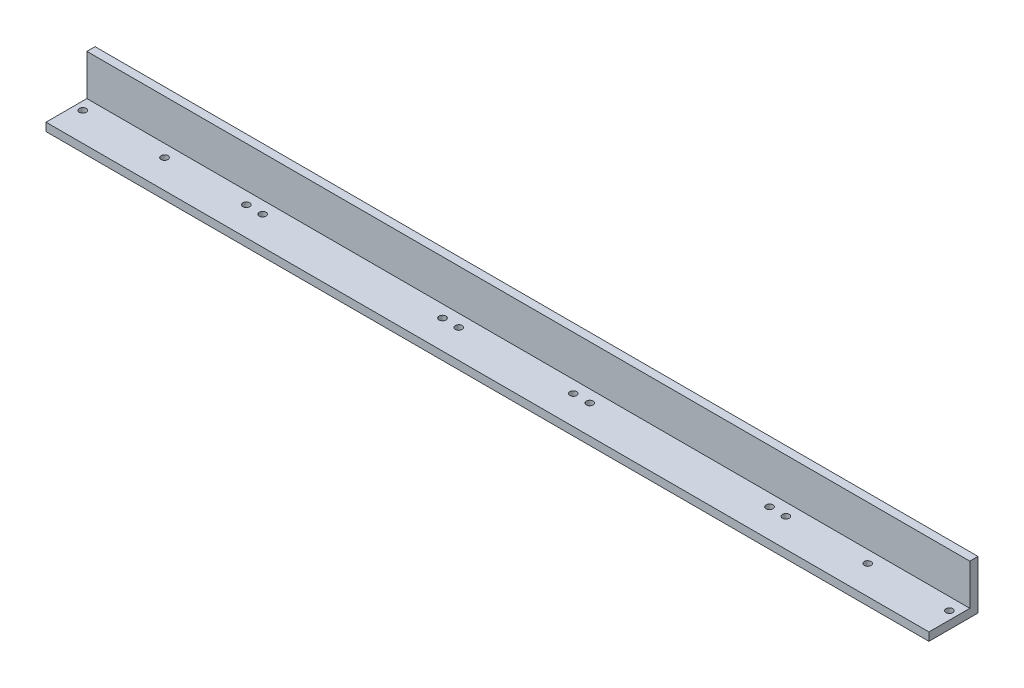
ISO-10303-21;
HEADER;
FILE_DESCRIPTION(('STEP AP214'),'2;1');
FILE_NAME('part.step','',(''),(''),'','','');
FILE_SCHEMA(('AUTOMOTIVE_DESIGN { 1 0 10303 214 1 1 1 1 }'));
ENDSEC;
DATA;
#1=APPLICATION_CONTEXT('core data for automotive mechanical design processes');
#2=APPLICATION_PROTOCOL_DEFINITION('international standard','automotive_design',2000,#1);
#3=PRODUCT_CONTEXT('',#1,'mechanical');
#4=PRODUCT('Part','Part','',(#3));
#5=PRODUCT_RELATED_PRODUCT_CATEGORY('part','',(#4));
#6=PRODUCT_DEFINITION_FORMATION('','',#4);
#7=PRODUCT_DEFINITION_CONTEXT('part definition',#1,'design');
#8=PRODUCT_DEFINITION('design','',#6,#7);
#9=PRODUCT_DEFINITION_SHAPE('','',#8);
#10=(LENGTH_UNIT() NAMED_UNIT(*) SI_UNIT(.MILLI.,.METRE.));
#11=(NAMED_UNIT(*) PLANE_ANGLE_UNIT() SI_UNIT($,.RADIAN.));
#12=(NAMED_UNIT(*) SI_UNIT($,.STERADIAN.) SOLID_ANGLE_UNIT());
#13=UNCERTAINTY_MEASURE_WITH_UNIT(LENGTH_MEASURE(1.E-05),#10,'distance_accuracy_value','');
#14=(GEOMETRIC_REPRESENTATION_CONTEXT(3) GLOBAL_UNCERTAINTY_ASSIGNED_CONTEXT((#13)) GLOBAL_UNIT_ASSIGNED_CONTEXT((#10,
#11,#12)) REPRESENTATION_CONTEXT('',''));
#15=CARTESIAN_POINT('',(0.,0.,0.));
#16=DIRECTION('',(0.,0.,1.));
#17=DIRECTION('',(1.,0.,0.));
#18=AXIS2_PLACEMENT_3D('',#15,#16,#17);
#19=CARTESIAN_POINT('',(342.9,0.,0.));
#20=DIRECTION('',(0.,0.,1.));
#21=DIRECTION('',(1.,0.,0.));
#22=AXIS2_PLACEMENT_3D('',#19,#20,#21);
#23=PLANE('',#22);
#24=DIRECTION('',(0.,1.,0.));
#25=VECTOR('',#24,1.);
#26=CARTESIAN_POINT('',(-342.9,0.,0.));
#27=LINE('',#26,#25);
#28=CARTESIAN_POINT('',(-342.9,0.,0.));
#29=VERTEX_POINT('',#28);
#30=CARTESIAN_POINT('',(-342.9,38.1,0.));
#31=VERTEX_POINT('',#30);
#32=EDGE_CURVE('E118',#29,#31,#27,.T.);
#33=ORIENTED_EDGE('',*,*,#32,.T.);
#34=DIRECTION('',(-1.,0.,0.));
#35=VECTOR('',#34,1.);
#36=CARTESIAN_POINT('',(342.9,38.1,0.));
#37=LINE('',#36,#35);
#38=CARTESIAN_POINT('',(342.9,38.1,0.));
#39=VERTEX_POINT('',#38);
#40=EDGE_CURVE('E11',#39,#31,#37,.T.);
#41=ORIENTED_EDGE('',*,*,#40,.F.);
#42=DIRECTION('',(0.,1.,0.));
#43=VECTOR('',#42,1.);
#44=CARTESIAN_POINT('',(342.9,0.,0.));
#45=LINE('',#44,#43);
#46=CARTESIAN_POINT('',(342.9,0.,0.));
#47=VERTEX_POINT('',#46);
#48=EDGE_CURVE('E83',#47,#39,#45,.T.);
#49=ORIENTED_EDGE('',*,*,#48,.F.);
#50=DIRECTION('',(-1.,0.,0.));
#51=VECTOR('',#50,1.);
#52=CARTESIAN_POINT('',(342.9,0.,0.));
#53=LINE('',#52,#51);
#54=EDGE_CURVE('E114',#47,#29,#53,.T.);
#55=ORIENTED_EDGE('',*,*,#54,.T.);
#56=EDGE_LOOP('',(#33,#41,#49,#55));
#57=FACE_BOUND('',#56,.T.);
#58=ADVANCED_FACE('F37',(#57),#23,.F.);
#59=CARTESIAN_POINT('',(342.9,38.1,6.35));
#60=DIRECTION('',(0.,1.,0.));
#61=DIRECTION('',(0.,0.,1.));
#62=AXIS2_PLACEMENT_3D('',#59,#60,#61);
#63=PLANE('',#62);
#64=DIRECTION('',(0.,0.,-1.));
#65=VECTOR('',#64,1.);
#66=CARTESIAN_POINT('',(-342.9,38.1,6.35));
#67=LINE('',#66,#65);
#68=CARTESIAN_POINT('',(-342.9,38.1,6.35));
#69=VERTEX_POINT('',#68);
#70=EDGE_CURVE('E121',#69,#31,#67,.T.);
#71=ORIENTED_EDGE('',*,*,#70,.F.);
#72=DIRECTION('',(-1.,0.,0.));
#73=VECTOR('',#72,1.);
#74=CARTESIAN_POINT('',(342.9,38.1,6.35));
#75=LINE('',#74,#73);
#76=CARTESIAN_POINT('',(342.9,38.1,6.35));
#77=VERTEX_POINT('',#76);
#78=EDGE_CURVE('E45',#77,#69,#75,.T.);
#79=ORIENTED_EDGE('',*,*,#78,.F.);
#80=DIRECTION('',(0.,0.,-1.));
#81=VECTOR('',#80,1.);
#82=CARTESIAN_POINT('',(342.9,38.1,6.35));
#83=LINE('',#82,#81);
#84=EDGE_CURVE('E230',#77,#39,#83,.T.);
#85=ORIENTED_EDGE('',*,*,#84,.T.);
#86=ORIENTED_EDGE('',*,*,#40,.T.);
#87=EDGE_LOOP('',(#71,#79,#85,#86));
#88=FACE_BOUND('',#87,.T.);
#89=ADVANCED_FACE('F140',(#88),#63,.T.);
#90=CARTESIAN_POINT('',(342.9,0.,6.35));
#91=DIRECTION('',(0.,0.,1.));
#92=DIRECTION('',(1.,0.,0.));
#93=AXIS2_PLACEMENT_3D('',#90,#91,#92);
#94=PLANE('',#93);
#95=DIRECTION('',(0.,1.,0.));
#96=VECTOR('',#95,1.);
#97=CARTESIAN_POINT('',(-342.9,0.,6.35));
#98=LINE('',#97,#96);
#99=CARTESIAN_POINT('',(-342.9,6.35,6.35));
#100=VERTEX_POINT('',#99);
#101=EDGE_CURVE('E125',#100,#69,#98,.T.);
#102=ORIENTED_EDGE('',*,*,#101,.F.);
#103=DIRECTION('',(-1.,0.,0.));
#104=VECTOR('',#103,1.);
#105=CARTESIAN_POINT('',(342.9,6.35,6.35));
#106=LINE('',#105,#104);
#107=CARTESIAN_POINT('',(342.9,6.35,6.35));
#108=VERTEX_POINT('',#107);
#109=EDGE_CURVE('E104',#108,#100,#106,.T.);
#110=ORIENTED_EDGE('',*,*,#109,.F.);
#111=DIRECTION('',(0.,1.,0.));
#112=VECTOR('',#111,1.);
#113=CARTESIAN_POINT('',(342.9,0.,6.35));
#114=LINE('',#113,#112);
#115=EDGE_CURVE('E110',#108,#77,#114,.T.);
#116=ORIENTED_EDGE('',*,*,#115,.T.);
#117=ORIENTED_EDGE('',*,*,#78,.T.);
#118=EDGE_LOOP('',(#102,#110,#116,#117));
#119=FACE_BOUND('',#118,.T.);
#120=ADVANCED_FACE('F137',(#119),#94,.T.);
#121=CARTESIAN_POINT('',(342.9,6.35,38.1));
#122=DIRECTION('',(0.,1.,0.));
#123=DIRECTION('',(0.,0.,1.));
#124=AXIS2_PLACEMENT_3D('',#121,#122,#123);
#125=PLANE('',#124);
#126=CARTESIAN_POINT('',(-336.55,6.35,15.875));
#127=DIRECTION('',(0.,1.,0.));
#128=DIRECTION('',(0.,0.,1.));
#129=AXIS2_PLACEMENT_3D('',#126,#127,#128);
#130=CIRCLE('',#129,2.66700000000003);
#131=CARTESIAN_POINT('',(-336.55,6.35,18.542));
#132=VERTEX_POINT('',#131);
#133=EDGE_CURVE('E176',#132,#132,#130,.T.);
#134=ORIENTED_EDGE('',*,*,#133,.F.);
#135=EDGE_LOOP('',(#134));
#136=FACE_BOUND('',#135,.T.);
#137=CARTESIAN_POINT('',(-273.05,6.35,15.8749999999995));
#138=DIRECTION('',(0.,1.,0.));
#139=DIRECTION('',(0.,0.,1.));
#140=AXIS2_PLACEMENT_3D('',#137,#138,#139);
#141=CIRCLE('',#140,2.66699999999997);
#142=CARTESIAN_POINT('',(-273.05,6.35,18.5419999999995));
#143=VERTEX_POINT('',#142);
#144=EDGE_CURVE('E180',#143,#143,#141,.T.);
#145=ORIENTED_EDGE('',*,*,#144,.F.);
#146=EDGE_LOOP('',(#145));
#147=FACE_BOUND('',#146,.T.);
#148=CARTESIAN_POINT('',(-209.55,6.35,15.875));
#149=DIRECTION('',(0.,1.,0.));
#150=DIRECTION('',(0.,0.,1.));
#151=AXIS2_PLACEMENT_3D('',#148,#149,#150);
#152=CIRCLE('',#151,2.66699999999997);
#153=CARTESIAN_POINT('',(-209.55,6.35,18.542));
#154=VERTEX_POINT('',#153);
#155=EDGE_CURVE('E184',#154,#154,#152,.T.);
#156=ORIENTED_EDGE('',*,*,#155,.F.);
#157=EDGE_LOOP('',(#156));
#158=FACE_BOUND('',#157,.T.);
#159=CARTESIAN_POINT('',(-196.85,6.35,15.875));
#160=DIRECTION('',(0.,1.,0.));
#161=DIRECTION('',(0.,0.,1.));
#162=AXIS2_PLACEMENT_3D('',#159,#160,#161);
#163=CIRCLE('',#162,2.667);
#164=CARTESIAN_POINT('',(-196.85,6.35,18.542));
#165=VERTEX_POINT('',#164);
#166=EDGE_CURVE('E188',#165,#165,#163,.T.);
#167=ORIENTED_EDGE('',*,*,#166,.F.);
#168=EDGE_LOOP('',(#167));
#169=FACE_BOUND('',#168,.T.);
#170=CARTESIAN_POINT('',(-57.1499999999999,6.35,15.875));
#171=DIRECTION('',(0.,1.,0.));
#172=DIRECTION('',(0.,0.,1.));
#173=AXIS2_PLACEMENT_3D('',#170,#171,#172);
#174=CIRCLE('',#173,2.66699999999999);
#175=CARTESIAN_POINT('',(-57.1499999999999,6.35,18.542));
#176=VERTEX_POINT('',#175);
#177=EDGE_CURVE('E192',#176,#176,#174,.T.);
#178=ORIENTED_EDGE('',*,*,#177,.F.);
#179=EDGE_LOOP('',(#178));
#180=FACE_BOUND('',#179,.T.);
#181=CARTESIAN_POINT('',(-44.4499999999999,6.35,15.875));
#182=DIRECTION('',(0.,1.,0.));
#183=DIRECTION('',(0.,0.,1.));
#184=AXIS2_PLACEMENT_3D('',#181,#182,#183);
#185=CIRCLE('',#184,2.66699999999999);
#186=CARTESIAN_POINT('',(-44.4499999999999,6.35,18.542));
#187=VERTEX_POINT('',#186);
#188=EDGE_CURVE('E196',#187,#187,#185,.T.);
#189=ORIENTED_EDGE('',*,*,#188,.F.);
#190=EDGE_LOOP('',(#189));
#191=FACE_BOUND('',#190,.T.);
#192=CARTESIAN_POINT('',(44.4500000000002,6.35,15.875));
#193=DIRECTION('',(0.,1.,0.));
#194=DIRECTION('',(0.,0.,1.));
#195=AXIS2_PLACEMENT_3D('',#192,#193,#194);
#196=CIRCLE('',#195,2.66699999999999);
#197=CARTESIAN_POINT('',(44.4500000000002,6.35,18.542));
#198=VERTEX_POINT('',#197);
#199=EDGE_CURVE('E200',#198,#198,#196,.T.);
#200=ORIENTED_EDGE('',*,*,#199,.F.);
#201=EDGE_LOOP('',(#200));
#202=FACE_BOUND('',#201,.T.);
#203=CARTESIAN_POINT('',(57.1500000000002,6.35,15.875));
#204=DIRECTION('',(0.,1.,0.));
#205=DIRECTION('',(0.,0.,1.));
#206=AXIS2_PLACEMENT_3D('',#203,#204,#205);
#207=CIRCLE('',#206,2.66699999999999);
#208=CARTESIAN_POINT('',(57.1500000000002,6.35,18.542));
#209=VERTEX_POINT('',#208);
#210=EDGE_CURVE('E204',#209,#209,#207,.T.);
#211=ORIENTED_EDGE('',*,*,#210,.F.);
#212=EDGE_LOOP('',(#211));
#213=FACE_BOUND('',#212,.T.);
#214=CARTESIAN_POINT('',(196.85,6.35,15.875));
#215=DIRECTION('',(0.,1.,0.));
#216=DIRECTION('',(0.,0.,1.));
#217=AXIS2_PLACEMENT_3D('',#214,#215,#216);
#218=CIRCLE('',#217,2.667);
#219=CARTESIAN_POINT('',(196.85,6.35,18.542));
#220=VERTEX_POINT('',#219);
#221=EDGE_CURVE('E208',#220,#220,#218,.T.);
#222=ORIENTED_EDGE('',*,*,#221,.F.);
#223=EDGE_LOOP('',(#222));
#224=FACE_BOUND('',#223,.T.);
#225=CARTESIAN_POINT('',(209.55,6.35,15.875));
#226=DIRECTION('',(0.,1.,0.));
#227=DIRECTION('',(0.,0.,1.));
#228=AXIS2_PLACEMENT_3D('',#225,#226,#227);
#229=CIRCLE('',#228,2.667);
#230=CARTESIAN_POINT('',(209.55,6.35,18.542));
#231=VERTEX_POINT('',#230);
#232=EDGE_CURVE('E212',#231,#231,#229,.T.);
#233=ORIENTED_EDGE('',*,*,#232,.F.);
#234=EDGE_LOOP('',(#233));
#235=FACE_BOUND('',#234,.T.);
#236=CARTESIAN_POINT('',(273.05,6.35,15.8749999999988));
#237=DIRECTION('',(0.,1.,0.));
#238=DIRECTION('',(0.,0.,1.));
#239=AXIS2_PLACEMENT_3D('',#236,#237,#238);
#240=CIRCLE('',#239,2.66700000000003);
#241=CARTESIAN_POINT('',(273.05,6.35,18.5419999999988));
#242=VERTEX_POINT('',#241);
#243=EDGE_CURVE('E216',#242,#242,#240,.T.);
#244=ORIENTED_EDGE('',*,*,#243,.F.);
#245=EDGE_LOOP('',(#244));
#246=FACE_BOUND('',#245,.T.);
#247=CARTESIAN_POINT('',(336.55,6.35,15.8749999999983));
#248=DIRECTION('',(0.,1.,0.));
#249=DIRECTION('',(0.,0.,1.));
#250=AXIS2_PLACEMENT_3D('',#247,#248,#249);
#251=CIRCLE('',#250,2.66700000000003);
#252=CARTESIAN_POINT('',(336.55,6.35,18.5419999999984));
#253=VERTEX_POINT('',#252);
#254=EDGE_CURVE('E219',#253,#253,#251,.T.);
#255=ORIENTED_EDGE('',*,*,#254,.F.);
#256=EDGE_LOOP('',(#255));
#257=FACE_BOUND('',#256,.T.);
#258=DIRECTION('',(0.,0.,-1.));
#259=VECTOR('',#258,1.);
#260=CARTESIAN_POINT('',(-342.9,6.35,38.1));
#261=LINE('',#260,#259);
#262=CARTESIAN_POINT('',(-342.9,6.35,38.1));
#263=VERTEX_POINT('',#262);
#264=EDGE_CURVE('E99',#263,#100,#261,.T.);
#265=ORIENTED_EDGE('',*,*,#264,.F.);
#266=DIRECTION('',(-1.,0.,0.));
#267=VECTOR('',#266,1.);
#268=CARTESIAN_POINT('',(342.9,6.35,38.1));
#269=LINE('',#268,#267);
#270=CARTESIAN_POINT('',(342.9,6.35,38.1));
#271=VERTEX_POINT('',#270);
#272=EDGE_CURVE('E94',#271,#263,#269,.T.);
#273=ORIENTED_EDGE('',*,*,#272,.F.);
#274=DIRECTION('',(0.,0.,-1.));
#275=VECTOR('',#274,1.);
#276=CARTESIAN_POINT('',(342.9,6.35,38.1));
#277=LINE('',#276,#275);
#278=EDGE_CURVE('E97',#271,#108,#277,.T.);
#279=ORIENTED_EDGE('',*,*,#278,.T.);
#280=ORIENTED_EDGE('',*,*,#109,.T.);
#281=EDGE_LOOP('',(#265,#273,#279,#280));
#282=FACE_BOUND('',#281,.T.);
#283=ADVANCED_FACE('F96',(#136,#147,#158,#169,#180,#191,#202,#213,#224,#235,#246,#257,#282),
#125,.T.);
#284=CARTESIAN_POINT('',(342.9,0.,38.1));
#285=DIRECTION('',(0.,0.,1.));
#286=DIRECTION('',(1.,0.,0.));
#287=AXIS2_PLACEMENT_3D('',#284,#285,#286);
#288=PLANE('',#287);
#289=DIRECTION('',(0.,1.,0.));
#290=VECTOR('',#289,1.);
#291=CARTESIAN_POINT('',(-342.9,0.,38.1));
#292=LINE('',#291,#290);
#293=CARTESIAN_POINT('',(-342.9,0.,38.1));
#294=VERTEX_POINT('',#293);
#295=EDGE_CURVE('E129',#294,#263,#292,.T.);
#296=ORIENTED_EDGE('',*,*,#295,.F.);
#297=DIRECTION('',(-1.,0.,0.));
#298=VECTOR('',#297,1.);
#299=CARTESIAN_POINT('',(342.9,0.,38.1));
#300=LINE('',#299,#298);
#301=CARTESIAN_POINT('',(342.9,0.,38.1));
#302=VERTEX_POINT('',#301);
#303=EDGE_CURVE('E74',#302,#294,#300,.T.);
#304=ORIENTED_EDGE('',*,*,#303,.F.);
#305=DIRECTION('',(0.,1.,0.));
#306=VECTOR('',#305,1.);
#307=CARTESIAN_POINT('',(342.9,0.,38.1));
#308=LINE('',#307,#306);
#309=EDGE_CURVE('E108',#302,#271,#308,.T.);
#310=ORIENTED_EDGE('',*,*,#309,.T.);
#311=ORIENTED_EDGE('',*,*,#272,.T.);
#312=EDGE_LOOP('',(#296,#304,#310,#311));
#313=FACE_BOUND('',#312,.T.);
#314=ADVANCED_FACE('F112',(#313),#288,.T.);
#315=CARTESIAN_POINT('',(342.9,0.,38.1));
#316=DIRECTION('',(0.,1.,0.));
#317=DIRECTION('',(0.,0.,1.));
#318=AXIS2_PLACEMENT_3D('',#315,#316,#317);
#319=PLANE('',#318);
#320=CARTESIAN_POINT('',(-336.55,0.,15.875));
#321=DIRECTION('',(0.,1.,0.));
#322=DIRECTION('',(0.,0.,1.));
#323=AXIS2_PLACEMENT_3D('',#320,#321,#322);
#324=CIRCLE('',#323,2.66700000000003);
#325=CARTESIAN_POINT('',(-336.55,0.,18.542));
#326=VERTEX_POINT('',#325);
#327=EDGE_CURVE('E122',#326,#326,#324,.F.);
#328=ORIENTED_EDGE('',*,*,#327,.F.);
#329=EDGE_LOOP('',(#328));
#330=FACE_BOUND('',#329,.T.);
#331=CARTESIAN_POINT('',(-273.05,0.,15.8749999999995));
#332=DIRECTION('',(0.,1.,0.));
#333=DIRECTION('',(0.,0.,1.));
#334=AXIS2_PLACEMENT_3D('',#331,#332,#333);
#335=CIRCLE('',#334,2.66699999999997);
#336=CARTESIAN_POINT('',(-273.05,0.,18.5419999999995));
#337=VERTEX_POINT('',#336);
#338=EDGE_CURVE('E265',#337,#337,#335,.F.);
#339=ORIENTED_EDGE('',*,*,#338,.F.);
#340=EDGE_LOOP('',(#339));
#341=FACE_BOUND('',#340,.T.);
#342=CARTESIAN_POINT('',(-209.55,0.,15.875));
#343=DIRECTION('',(0.,1.,0.));
#344=DIRECTION('',(0.,0.,1.));
#345=AXIS2_PLACEMENT_3D('',#342,#343,#344);
#346=CIRCLE('',#345,2.66699999999997);
#347=CARTESIAN_POINT('',(-209.55,0.,18.542));
#348=VERTEX_POINT('',#347);
#349=EDGE_CURVE('E261',#348,#348,#346,.F.);
#350=ORIENTED_EDGE('',*,*,#349,.F.);
#351=EDGE_LOOP('',(#350));
#352=FACE_BOUND('',#351,.T.);
#353=CARTESIAN_POINT('',(-196.85,0.,15.875));
#354=DIRECTION('',(0.,1.,0.));
#355=DIRECTION('',(0.,0.,1.));
#356=AXIS2_PLACEMENT_3D('',#353,#354,#355);
#357=CIRCLE('',#356,2.667);
#358=CARTESIAN_POINT('',(-196.85,0.,18.542));
#359=VERTEX_POINT('',#358);
#360=EDGE_CURVE('E257',#359,#359,#357,.F.);
#361=ORIENTED_EDGE('',*,*,#360,.F.);
#362=EDGE_LOOP('',(#361));
#363=FACE_BOUND('',#362,.T.);
#364=CARTESIAN_POINT('',(-57.1499999999999,0.,15.875));
#365=DIRECTION('',(0.,1.,0.));
#366=DIRECTION('',(0.,0.,1.));
#367=AXIS2_PLACEMENT_3D('',#364,#365,#366);
#368=CIRCLE('',#367,2.66699999999999);
#369=CARTESIAN_POINT('',(-57.1499999999999,0.,18.542));
#370=VERTEX_POINT('',#369);
#371=EDGE_CURVE('E253',#370,#370,#368,.F.);
#372=ORIENTED_EDGE('',*,*,#371,.F.);
#373=EDGE_LOOP('',(#372));
#374=FACE_BOUND('',#373,.T.);
#375=CARTESIAN_POINT('',(-44.4499999999999,0.,15.875));
#376=DIRECTION('',(0.,1.,0.));
#377=DIRECTION('',(0.,0.,1.));
#378=AXIS2_PLACEMENT_3D('',#375,#376,#377);
#379=CIRCLE('',#378,2.66699999999999);
#380=CARTESIAN_POINT('',(-44.4499999999999,0.,18.542));
#381=VERTEX_POINT('',#380);
#382=EDGE_CURVE('E249',#381,#381,#379,.F.);
#383=ORIENTED_EDGE('',*,*,#382,.F.);
#384=EDGE_LOOP('',(#383));
#385=FACE_BOUND('',#384,.T.);
#386=CARTESIAN_POINT('',(44.4500000000002,0.,15.875));
#387=DIRECTION('',(0.,1.,0.));
#388=DIRECTION('',(0.,0.,1.));
#389=AXIS2_PLACEMENT_3D('',#386,#387,#388);
#390=CIRCLE('',#389,2.66699999999999);
#391=CARTESIAN_POINT('',(44.4500000000002,0.,18.542));
#392=VERTEX_POINT('',#391);
#393=EDGE_CURVE('E245',#392,#392,#390,.F.);
#394=ORIENTED_EDGE('',*,*,#393,.F.);
#395=EDGE_LOOP('',(#394));
#396=FACE_BOUND('',#395,.T.);
#397=CARTESIAN_POINT('',(57.1500000000002,0.,15.875));
#398=DIRECTION('',(0.,1.,0.));
#399=DIRECTION('',(0.,0.,1.));
#400=AXIS2_PLACEMENT_3D('',#397,#398,#399);
#401=CIRCLE('',#400,2.66699999999999);
#402=CARTESIAN_POINT('',(57.1500000000002,0.,18.542));
#403=VERTEX_POINT('',#402);
#404=EDGE_CURVE('E241',#403,#403,#401,.F.);
#405=ORIENTED_EDGE('',*,*,#404,.F.);
#406=EDGE_LOOP('',(#405));
#407=FACE_BOUND('',#406,.T.);
#408=CARTESIAN_POINT('',(196.85,0.,15.875));
#409=DIRECTION('',(0.,1.,0.));
#410=DIRECTION('',(0.,0.,1.));
#411=AXIS2_PLACEMENT_3D('',#408,#409,#410);
#412=CIRCLE('',#411,2.667);
#413=CARTESIAN_POINT('',(196.85,0.,18.542));
#414=VERTEX_POINT('',#413);
#415=EDGE_CURVE('E237',#414,#414,#412,.F.);
#416=ORIENTED_EDGE('',*,*,#415,.F.);
#417=EDGE_LOOP('',(#416));
#418=FACE_BOUND('',#417,.T.);
#419=CARTESIAN_POINT('',(209.55,0.,15.875));
#420=DIRECTION('',(0.,1.,0.));
#421=DIRECTION('',(0.,0.,1.));
#422=AXIS2_PLACEMENT_3D('',#419,#420,#421);
#423=CIRCLE('',#422,2.667);
#424=CARTESIAN_POINT('',(209.55,0.,18.542));
#425=VERTEX_POINT('',#424);
#426=EDGE_CURVE('E233',#425,#425,#423,.F.);
#427=ORIENTED_EDGE('',*,*,#426,.F.);
#428=EDGE_LOOP('',(#427));
#429=FACE_BOUND('',#428,.T.);
#430=CARTESIAN_POINT('',(273.05,0.,15.8749999999988));
#431=DIRECTION('',(0.,1.,0.));
#432=DIRECTION('',(0.,0.,1.));
#433=AXIS2_PLACEMENT_3D('',#430,#431,#432);
#434=CIRCLE('',#433,2.66700000000003);
#435=CARTESIAN_POINT('',(273.05,0.,18.5419999999988));
#436=VERTEX_POINT('',#435);
#437=EDGE_CURVE('E226',#436,#436,#434,.F.);
#438=ORIENTED_EDGE('',*,*,#437,.F.);
#439=EDGE_LOOP('',(#438));
#440=FACE_BOUND('',#439,.T.);
#441=CARTESIAN_POINT('',(336.55,0.,15.8749999999983));
#442=DIRECTION('',(0.,1.,0.));
#443=DIRECTION('',(0.,0.,1.));
#444=AXIS2_PLACEMENT_3D('',#441,#442,#443);
#445=CIRCLE('',#444,2.66700000000003);
#446=CARTESIAN_POINT('',(336.55,0.,18.5419999999984));
#447=VERTEX_POINT('',#446);
#448=EDGE_CURVE('E221',#447,#447,#445,.F.);
#449=ORIENTED_EDGE('',*,*,#448,.F.);
#450=EDGE_LOOP('',(#449));
#451=FACE_BOUND('',#450,.T.);
#452=DIRECTION('',(0.,0.,-1.));
#453=VECTOR('',#452,1.);
#454=CARTESIAN_POINT('',(-342.9,0.,38.1));
#455=LINE('',#454,#453);
#456=EDGE_CURVE('E77',#294,#29,#455,.T.);
#457=ORIENTED_EDGE('',*,*,#456,.T.);
#458=ORIENTED_EDGE('',*,*,#54,.F.);
#459=DIRECTION('',(0.,0.,-1.));
#460=VECTOR('',#459,1.);
#461=CARTESIAN_POINT('',(342.9,0.,38.1));
#462=LINE('',#461,#460);
#463=EDGE_CURVE('E53',#302,#47,#462,.T.);
#464=ORIENTED_EDGE('',*,*,#463,.F.);
#465=ORIENTED_EDGE('',*,*,#303,.T.);
#466=EDGE_LOOP('',(#457,#458,#464,#465));
#467=FACE_BOUND('',#466,.T.);
#468=ADVANCED_FACE('F145',(#330,#341,#352,#363,#374,#385,#396,#407,#418,#429,#440,#451,#467),
#319,.F.);
#469=CARTESIAN_POINT('',(342.9,0.,0.));
#470=DIRECTION('',(-1.,0.,0.));
#471=DIRECTION('',(0.,0.,1.));
#472=AXIS2_PLACEMENT_3D('',#469,#470,#471);
#473=PLANE('',#472);
#474=ORIENTED_EDGE('',*,*,#48,.T.);
#475=ORIENTED_EDGE('',*,*,#84,.F.);
#476=ORIENTED_EDGE('',*,*,#115,.F.);
#477=ORIENTED_EDGE('',*,*,#278,.F.);
#478=ORIENTED_EDGE('',*,*,#309,.F.);
#479=ORIENTED_EDGE('',*,*,#463,.T.);
#480=EDGE_LOOP('',(#474,#475,#476,#477,#478,#479));
#481=FACE_BOUND('',#480,.T.);
#482=ADVANCED_FACE('F107',(#481),#473,.F.);
#483=CARTESIAN_POINT('',(-342.9,0.,0.));
#484=DIRECTION('',(-1.,0.,0.));
#485=DIRECTION('',(0.,0.,1.));
#486=AXIS2_PLACEMENT_3D('',#483,#484,#485);
#487=PLANE('',#486);
#488=ORIENTED_EDGE('',*,*,#32,.F.);
#489=ORIENTED_EDGE('',*,*,#456,.F.);
#490=ORIENTED_EDGE('',*,*,#295,.T.);
#491=ORIENTED_EDGE('',*,*,#264,.T.);
#492=ORIENTED_EDGE('',*,*,#101,.T.);
#493=ORIENTED_EDGE('',*,*,#70,.T.);
#494=EDGE_LOOP('',(#488,#489,#490,#491,#492,#493));
#495=FACE_BOUND('',#494,.T.);
#496=ADVANCED_FACE('F143',(#495),#487,.T.);
#497=CARTESIAN_POINT('',(336.55,-0.00100000000000013,15.8749999999983));
#498=DIRECTION('',(0.,1.,0.));
#499=DIRECTION('',(0.,0.,1.));
#500=AXIS2_PLACEMENT_3D('',#497,#498,#499);
#501=CYLINDRICAL_SURFACE('',#500,2.66700000000003);
#502=ORIENTED_EDGE('',*,*,#254,.T.);
#503=EDGE_LOOP('',(#502));
#504=FACE_BOUND('',#503,.T.);
#505=ORIENTED_EDGE('',*,*,#448,.T.);
#506=EDGE_LOOP('',(#505));
#507=FACE_BOUND('',#506,.T.);
#508=ADVANCED_FACE('F318',(#504,#507),#501,.F.);
#509=CARTESIAN_POINT('',(273.05,-0.00100000000000013,15.8749999999988));
#510=DIRECTION('',(0.,1.,0.));
#511=DIRECTION('',(0.,0.,1.));
#512=AXIS2_PLACEMENT_3D('',#509,#510,#511);
#513=CYLINDRICAL_SURFACE('',#512,2.66700000000003);
#514=ORIENTED_EDGE('',*,*,#243,.T.);
#515=EDGE_LOOP('',(#514));
#516=FACE_BOUND('',#515,.T.);
#517=ORIENTED_EDGE('',*,*,#437,.T.);
#518=EDGE_LOOP('',(#517));
#519=FACE_BOUND('',#518,.T.);
#520=ADVANCED_FACE('F314',(#516,#519),#513,.F.);
#521=CARTESIAN_POINT('',(209.55,-0.00100000000000013,15.875));
#522=DIRECTION('',(0.,1.,0.));
#523=DIRECTION('',(0.,0.,1.));
#524=AXIS2_PLACEMENT_3D('',#521,#522,#523);
#525=CYLINDRICAL_SURFACE('',#524,2.667);
#526=ORIENTED_EDGE('',*,*,#232,.T.);
#527=EDGE_LOOP('',(#526));
#528=FACE_BOUND('',#527,.T.);
#529=ORIENTED_EDGE('',*,*,#426,.T.);
#530=EDGE_LOOP('',(#529));
#531=FACE_BOUND('',#530,.T.);
#532=ADVANCED_FACE('F310',(#528,#531),#525,.F.);
#533=CARTESIAN_POINT('',(196.85,-0.00100000000000013,15.875));
#534=DIRECTION('',(0.,1.,0.));
#535=DIRECTION('',(0.,0.,1.));
#536=AXIS2_PLACEMENT_3D('',#533,#534,#535);
#537=CYLINDRICAL_SURFACE('',#536,2.667);
#538=ORIENTED_EDGE('',*,*,#221,.T.);
#539=EDGE_LOOP('',(#538));
#540=FACE_BOUND('',#539,.T.);
#541=ORIENTED_EDGE('',*,*,#415,.T.);
#542=EDGE_LOOP('',(#541));
#543=FACE_BOUND('',#542,.T.);
#544=ADVANCED_FACE('F306',(#540,#543),#537,.F.);
#545=CARTESIAN_POINT('',(57.1500000000002,-0.00100000000000013,15.875));
#546=DIRECTION('',(0.,1.,0.));
#547=DIRECTION('',(0.,0.,1.));
#548=AXIS2_PLACEMENT_3D('',#545,#546,#547);
#549=CYLINDRICAL_SURFACE('',#548,2.66699999999999);
#550=ORIENTED_EDGE('',*,*,#210,.T.);
#551=EDGE_LOOP('',(#550));
#552=FACE_BOUND('',#551,.T.);
#553=ORIENTED_EDGE('',*,*,#404,.T.);
#554=EDGE_LOOP('',(#553));
#555=FACE_BOUND('',#554,.T.);
#556=ADVANCED_FACE('F302',(#552,#555),#549,.F.);
#557=CARTESIAN_POINT('',(44.4500000000002,-0.00100000000000013,15.875));
#558=DIRECTION('',(0.,1.,0.));
#559=DIRECTION('',(0.,0.,1.));
#560=AXIS2_PLACEMENT_3D('',#557,#558,#559);
#561=CYLINDRICAL_SURFACE('',#560,2.66699999999999);
#562=ORIENTED_EDGE('',*,*,#199,.T.);
#563=EDGE_LOOP('',(#562));
#564=FACE_BOUND('',#563,.T.);
#565=ORIENTED_EDGE('',*,*,#393,.T.);
#566=EDGE_LOOP('',(#565));
#567=FACE_BOUND('',#566,.T.);
#568=ADVANCED_FACE('F298',(#564,#567),#561,.F.);
#569=CARTESIAN_POINT('',(-44.4499999999999,-0.00100000000000013,15.875));
#570=DIRECTION('',(0.,1.,0.));
#571=DIRECTION('',(0.,0.,1.));
#572=AXIS2_PLACEMENT_3D('',#569,#570,#571);
#573=CYLINDRICAL_SURFACE('',#572,2.66699999999999);
#574=ORIENTED_EDGE('',*,*,#188,.T.);
#575=EDGE_LOOP('',(#574));
#576=FACE_BOUND('',#575,.T.);
#577=ORIENTED_EDGE('',*,*,#382,.T.);
#578=EDGE_LOOP('',(#577));
#579=FACE_BOUND('',#578,.T.);
#580=ADVANCED_FACE('F294',(#576,#579),#573,.F.);
#581=CARTESIAN_POINT('',(-57.1499999999999,-0.00100000000000013,15.875));
#582=DIRECTION('',(0.,1.,0.));
#583=DIRECTION('',(0.,0.,1.));
#584=AXIS2_PLACEMENT_3D('',#581,#582,#583);
#585=CYLINDRICAL_SURFACE('',#584,2.66699999999999);
#586=ORIENTED_EDGE('',*,*,#177,.T.);
#587=EDGE_LOOP('',(#586));
#588=FACE_BOUND('',#587,.T.);
#589=ORIENTED_EDGE('',*,*,#371,.T.);
#590=EDGE_LOOP('',(#589));
#591=FACE_BOUND('',#590,.T.);
#592=ADVANCED_FACE('F290',(#588,#591),#585,.F.);
#593=CARTESIAN_POINT('',(-196.85,-0.00100000000000013,15.875));
#594=DIRECTION('',(0.,1.,0.));
#595=DIRECTION('',(0.,0.,1.));
#596=AXIS2_PLACEMENT_3D('',#593,#594,#595);
#597=CYLINDRICAL_SURFACE('',#596,2.667);
#598=ORIENTED_EDGE('',*,*,#166,.T.);
#599=EDGE_LOOP('',(#598));
#600=FACE_BOUND('',#599,.T.);
#601=ORIENTED_EDGE('',*,*,#360,.T.);
#602=EDGE_LOOP('',(#601));
#603=FACE_BOUND('',#602,.T.);
#604=ADVANCED_FACE('F286',(#600,#603),#597,.F.);
#605=CARTESIAN_POINT('',(-209.55,-0.00100000000000013,15.875));
#606=DIRECTION('',(0.,1.,0.));
#607=DIRECTION('',(0.,0.,1.));
#608=AXIS2_PLACEMENT_3D('',#605,#606,#607);
#609=CYLINDRICAL_SURFACE('',#608,2.66699999999997);
#610=ORIENTED_EDGE('',*,*,#155,.T.);
#611=EDGE_LOOP('',(#610));
#612=FACE_BOUND('',#611,.T.);
#613=ORIENTED_EDGE('',*,*,#349,.T.);
#614=EDGE_LOOP('',(#613));
#615=FACE_BOUND('',#614,.T.);
#616=ADVANCED_FACE('F280',(#612,#615),#609,.F.);
#617=CARTESIAN_POINT('',(-273.05,-0.00100000000000013,15.8749999999995));
#618=DIRECTION('',(0.,1.,0.));
#619=DIRECTION('',(0.,0.,1.));
#620=AXIS2_PLACEMENT_3D('',#617,#618,#619);
#621=CYLINDRICAL_SURFACE('',#620,2.66699999999997);
#622=ORIENTED_EDGE('',*,*,#144,.T.);
#623=EDGE_LOOP('',(#622));
#624=FACE_BOUND('',#623,.T.);
#625=ORIENTED_EDGE('',*,*,#338,.T.);
#626=EDGE_LOOP('',(#625));
#627=FACE_BOUND('',#626,.T.);
#628=ADVANCED_FACE('F275',(#624,#627),#621,.F.);
#629=CARTESIAN_POINT('',(-336.55,-0.00100000000000013,15.875));
#630=DIRECTION('',(0.,1.,0.));
#631=DIRECTION('',(0.,0.,1.));
#632=AXIS2_PLACEMENT_3D('',#629,#630,#631);
#633=CYLINDRICAL_SURFACE('',#632,2.66700000000003);
#634=ORIENTED_EDGE('',*,*,#133,.T.);
#635=EDGE_LOOP('',(#634));
#636=FACE_BOUND('',#635,.T.);
#637=ORIENTED_EDGE('',*,*,#327,.T.);
#638=EDGE_LOOP('',(#637));
#639=FACE_BOUND('',#638,.T.);
#640=ADVANCED_FACE('F272',(#636,#639),#633,.F.);
#641=CLOSED_SHELL('',(#58,#89,#120,#283,#314,#468,#482,#496,#508,#520,#532,#544,#556,#568,#580,
#592,#604,#616,#628,#640));
#642=MANIFOLD_SOLID_BREP('B2',#641);
#643=ADVANCED_BREP_SHAPE_REPRESENTATION('',(#18,#642),#14);
#644=SHAPE_DEFINITION_REPRESENTATION(#9,#643);
ENDSEC;
END-ISO-10303-21;
